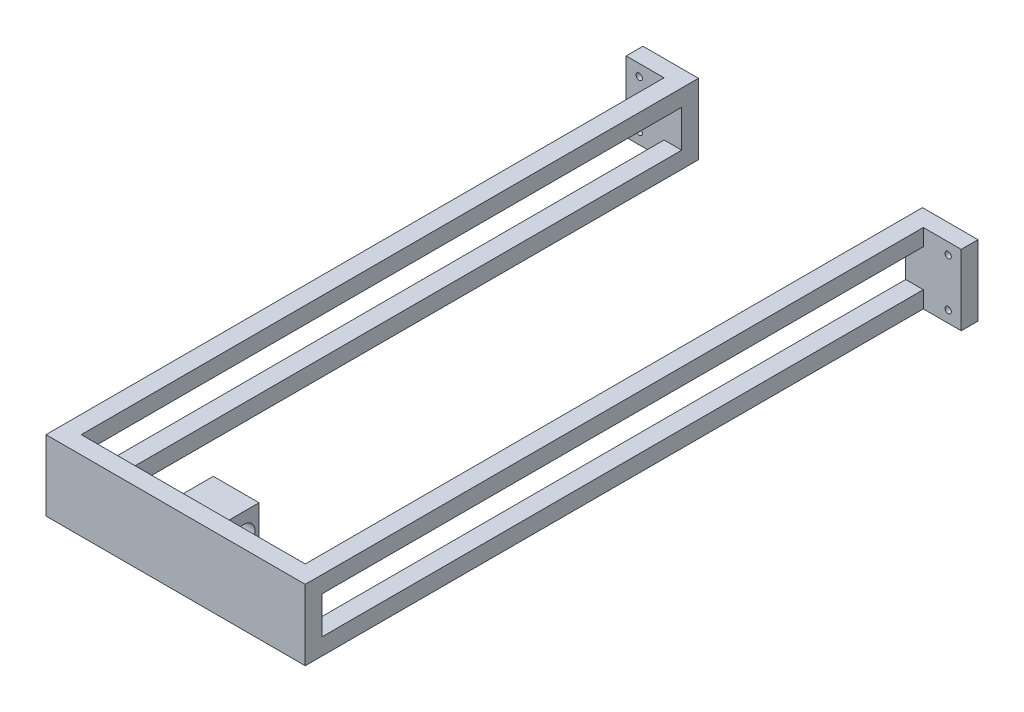
ISO-10303-21;
HEADER;
FILE_DESCRIPTION(('STEP AP214'),'2;1');
FILE_NAME('part.step','',(''),(''),'','','');
FILE_SCHEMA(('AUTOMOTIVE_DESIGN { 1 0 10303 214 1 1 1 1 }'));
ENDSEC;
DATA;
#1=APPLICATION_CONTEXT('core data for automotive mechanical design processes');
#2=APPLICATION_PROTOCOL_DEFINITION('international standard','automotive_design',2000,#1);
#3=PRODUCT_CONTEXT('',#1,'mechanical');
#4=PRODUCT('Part','Part','',(#3));
#5=PRODUCT_RELATED_PRODUCT_CATEGORY('part','',(#4));
#6=PRODUCT_DEFINITION_FORMATION('','',#4);
#7=PRODUCT_DEFINITION_CONTEXT('part definition',#1,'design');
#8=PRODUCT_DEFINITION('design','',#6,#7);
#9=PRODUCT_DEFINITION_SHAPE('','',#8);
#10=(LENGTH_UNIT() NAMED_UNIT(*) SI_UNIT(.MILLI.,.METRE.));
#11=(NAMED_UNIT(*) PLANE_ANGLE_UNIT() SI_UNIT($,.RADIAN.));
#12=(NAMED_UNIT(*) SI_UNIT($,.STERADIAN.) SOLID_ANGLE_UNIT());
#13=UNCERTAINTY_MEASURE_WITH_UNIT(LENGTH_MEASURE(1.E-05),#10,'distance_accuracy_value','');
#14=(GEOMETRIC_REPRESENTATION_CONTEXT(3) GLOBAL_UNCERTAINTY_ASSIGNED_CONTEXT((#13)) GLOBAL_UNIT_ASSIGNED_CONTEXT((#10,
#11,#12)) REPRESENTATION_CONTEXT('',''));
#15=CARTESIAN_POINT('',(0.,0.,0.));
#16=DIRECTION('',(0.,0.,1.));
#17=DIRECTION('',(1.,0.,0.));
#18=AXIS2_PLACEMENT_3D('',#15,#16,#17);
#19=CARTESIAN_POINT('',(181.925,6.7,222.6));
#20=DIRECTION('',(0.,0.,1.));
#21=DIRECTION('',(1.,0.,0.));
#22=AXIS2_PLACEMENT_3D('',#19,#20,#21);
#23=PLANE('',#22);
#24=DIRECTION('',(0.,1.,0.));
#25=VECTOR('',#24,1.);
#26=CARTESIAN_POINT('',(-8.23955739482071,8.01973597055769,222.6));
#27=LINE('',#26,#25);
#28=CARTESIAN_POINT('',(-8.23955739482071,-6.7,222.6));
#29=VERTEX_POINT('',#28);
#30=CARTESIAN_POINT('',(-8.23955739482071,6.7,222.6));
#31=VERTEX_POINT('',#30);
#32=EDGE_CURVE('E544',#29,#31,#27,.T.);
#33=ORIENTED_EDGE('',*,*,#32,.F.);
#34=DIRECTION('',(-1.,0.,0.));
#35=VECTOR('',#34,1.);
#36=CARTESIAN_POINT('',(181.925,-6.7,222.6));
#37=LINE('',#36,#35);
#38=CARTESIAN_POINT('',(-46.675,-6.69999999999998,222.6));
#39=VERTEX_POINT('',#38);
#40=EDGE_CURVE('E309',#29,#39,#37,.T.);
#41=ORIENTED_EDGE('',*,*,#40,.T.);
#42=DIRECTION('',(0.,1.,0.));
#43=VECTOR('',#42,1.);
#44=CARTESIAN_POINT('',(-46.675,6.7,222.6));
#45=LINE('',#44,#43);
#46=CARTESIAN_POINT('',(-46.675,6.7,222.6));
#47=VERTEX_POINT('',#46);
#48=EDGE_CURVE('E290',#39,#47,#45,.T.);
#49=ORIENTED_EDGE('',*,*,#48,.T.);
#50=DIRECTION('',(-1.,0.,0.));
#51=VECTOR('',#50,1.);
#52=CARTESIAN_POINT('',(181.925,6.7,222.6));
#53=LINE('',#52,#51);
#54=EDGE_CURVE('E302',#31,#47,#53,.T.);
#55=ORIENTED_EDGE('',*,*,#54,.F.);
#56=EDGE_LOOP('',(#33,#41,#49,#55));
#57=FACE_BOUND('',#56,.T.);
#58=ADVANCED_FACE('F47',(#57),#23,.F.);
#59=DIRECTION('',(0.,-1.,0.));
#60=VECTOR('',#59,1.);
#61=CARTESIAN_POINT('',(8.23955739482071,8.01973597055769,222.6));
#62=LINE('',#61,#60);
#63=CARTESIAN_POINT('',(8.23955739482071,6.7,222.6));
#64=VERTEX_POINT('',#63);
#65=CARTESIAN_POINT('',(8.23955739482071,-6.7,222.6));
#66=VERTEX_POINT('',#65);
#67=EDGE_CURVE('E255',#64,#66,#62,.T.);
#68=ORIENTED_EDGE('',*,*,#67,.F.);
#69=CARTESIAN_POINT('',(46.675,6.7,222.6));
#70=VERTEX_POINT('',#69);
#71=EDGE_CURVE('E304',#70,#64,#53,.T.);
#72=ORIENTED_EDGE('',*,*,#71,.F.);
#73=DIRECTION('',(0.,1.,0.));
#74=VECTOR('',#73,1.);
#75=CARTESIAN_POINT('',(46.675,215.9,222.6));
#76=LINE('',#75,#74);
#77=CARTESIAN_POINT('',(46.675,-6.70000000000001,222.6));
#78=VERTEX_POINT('',#77);
#79=EDGE_CURVE('E512',#78,#70,#76,.T.);
#80=ORIENTED_EDGE('',*,*,#79,.F.);
#81=EDGE_CURVE('E308',#78,#66,#37,.T.);
#82=ORIENTED_EDGE('',*,*,#81,.T.);
#83=EDGE_LOOP('',(#68,#72,#80,#82));
#84=FACE_BOUND('',#83,.T.);
#85=ADVANCED_FACE('F575',(#84),#23,.F.);
#86=CARTESIAN_POINT('',(0.,215.9,222.25));
#87=DIRECTION('',(0.,0.,-1.));
#88=DIRECTION('',(-1.,0.,0.));
#89=AXIS2_PLACEMENT_3D('',#86,#87,#88);
#90=PLANE('',#89);
#91=DIRECTION('',(-1.,0.,0.));
#92=VECTOR('',#91,1.);
#93=CARTESIAN_POINT('',(0.,8.01973597055769,222.25));
#94=LINE('',#93,#92);
#95=CARTESIAN_POINT('',(8.23955739482071,8.01973597055769,222.25));
#96=VERTEX_POINT('',#95);
#97=CARTESIAN_POINT('',(-8.23955739482071,8.01973597055769,222.25));
#98=VERTEX_POINT('',#97);
#99=EDGE_CURVE('E11',#96,#98,#94,.T.);
#100=ORIENTED_EDGE('',*,*,#99,.T.);
#101=DIRECTION('',(0.,-1.,0.));
#102=VECTOR('',#101,1.);
#103=CARTESIAN_POINT('',(-8.23955739482071,215.9,222.25));
#104=LINE('',#103,#102);
#105=CARTESIAN_POINT('',(-8.23955739482071,6.70000000000001,222.25));
#106=VERTEX_POINT('',#105);
#107=EDGE_CURVE('E256',#98,#106,#104,.T.);
#108=ORIENTED_EDGE('',*,*,#107,.T.);
#109=DIRECTION('',(1.,0.,0.));
#110=VECTOR('',#109,1.);
#111=CARTESIAN_POINT('',(0.,6.70000000000001,222.25));
#112=LINE('',#111,#110);
#113=CARTESIAN_POINT('',(-40.325,6.70000000000001,222.25));
#114=VERTEX_POINT('',#113);
#115=EDGE_CURVE('E504',#114,#106,#112,.T.);
#116=ORIENTED_EDGE('',*,*,#115,.F.);
#117=DIRECTION('',(0.,-1.,0.));
#118=VECTOR('',#117,1.);
#119=CARTESIAN_POINT('',(-40.325,215.9,222.25));
#120=LINE('',#119,#118);
#121=CARTESIAN_POINT('',(-40.325,12.7,222.25));
#122=VERTEX_POINT('',#121);
#123=EDGE_CURVE('E399',#122,#114,#120,.T.);
#124=ORIENTED_EDGE('',*,*,#123,.F.);
#125=DIRECTION('',(-1.,0.,0.));
#126=VECTOR('',#125,1.);
#127=CARTESIAN_POINT('',(-60.325,12.7,222.25));
#128=LINE('',#127,#126);
#129=CARTESIAN_POINT('',(40.325,12.7,222.25));
#130=VERTEX_POINT('',#129);
#131=EDGE_CURVE('E474',#130,#122,#128,.T.);
#132=ORIENTED_EDGE('',*,*,#131,.F.);
#133=DIRECTION('',(0.,-1.,0.));
#134=VECTOR('',#133,1.);
#135=CARTESIAN_POINT('',(40.325,215.9,222.25));
#136=LINE('',#135,#134);
#137=CARTESIAN_POINT('',(40.325,6.70000000000001,222.25));
#138=VERTEX_POINT('',#137);
#139=EDGE_CURVE('E402',#130,#138,#136,.T.);
#140=ORIENTED_EDGE('',*,*,#139,.T.);
#141=CARTESIAN_POINT('',(8.23955739482071,6.70000000000001,222.25));
#142=VERTEX_POINT('',#141);
#143=EDGE_CURVE('E501',#142,#138,#112,.T.);
#144=ORIENTED_EDGE('',*,*,#143,.F.);
#145=DIRECTION('',(0.,1.,0.));
#146=VECTOR('',#145,1.);
#147=CARTESIAN_POINT('',(8.23955739482071,215.9,222.25));
#148=LINE('',#147,#146);
#149=EDGE_CURVE('E68',#142,#96,#148,.T.);
#150=ORIENTED_EDGE('',*,*,#149,.T.);
#151=EDGE_LOOP('',(#100,#108,#116,#124,#132,#140,#144,#150));
#152=FACE_BOUND('',#151,.T.);
#153=ADVANCED_FACE('F578',(#152),#90,.T.);
#154=DIRECTION('',(-1.,0.,0.));
#155=VECTOR('',#154,1.);
#156=CARTESIAN_POINT('',(0.,-6.70000000000001,222.25));
#157=LINE('',#156,#155);
#158=CARTESIAN_POINT('',(-8.23955739482071,-6.70000000000001,222.25));
#159=VERTEX_POINT('',#158);
#160=CARTESIAN_POINT('',(-40.325,-6.70000000000001,222.25));
#161=VERTEX_POINT('',#160);
#162=EDGE_CURVE('E496',#159,#161,#157,.T.);
#163=ORIENTED_EDGE('',*,*,#162,.F.);
#164=DIRECTION('',(0.,-1.,0.));
#165=VECTOR('',#164,1.);
#166=CARTESIAN_POINT('',(-8.23955739482071,215.9,222.25));
#167=LINE('',#166,#165);
#168=CARTESIAN_POINT('',(-8.23955739482071,-8.01973597055769,222.25));
#169=VERTEX_POINT('',#168);
#170=EDGE_CURVE('E277',#159,#169,#167,.T.);
#171=ORIENTED_EDGE('',*,*,#170,.T.);
#172=DIRECTION('',(1.,0.,0.));
#173=VECTOR('',#172,1.);
#174=CARTESIAN_POINT('',(0.,-8.01973597055769,222.25));
#175=LINE('',#174,#173);
#176=CARTESIAN_POINT('',(8.23955739482071,-8.01973597055769,222.25));
#177=VERTEX_POINT('',#176);
#178=EDGE_CURVE('E56',#169,#177,#175,.T.);
#179=ORIENTED_EDGE('',*,*,#178,.T.);
#180=DIRECTION('',(0.,1.,0.));
#181=VECTOR('',#180,1.);
#182=CARTESIAN_POINT('',(8.23955739482071,215.9,222.25));
#183=LINE('',#182,#181);
#184=CARTESIAN_POINT('',(8.23955739482071,-6.7,222.25));
#185=VERTEX_POINT('',#184);
#186=EDGE_CURVE('E257',#177,#185,#183,.T.);
#187=ORIENTED_EDGE('',*,*,#186,.T.);
#188=CARTESIAN_POINT('',(40.325,-6.70000000000001,222.25));
#189=VERTEX_POINT('',#188);
#190=EDGE_CURVE('E498',#189,#185,#157,.T.);
#191=ORIENTED_EDGE('',*,*,#190,.F.);
#192=CARTESIAN_POINT('',(40.325,-12.7,222.25));
#193=VERTEX_POINT('',#192);
#194=EDGE_CURVE('E390',#189,#193,#136,.T.);
#195=ORIENTED_EDGE('',*,*,#194,.T.);
#196=DIRECTION('',(1.,0.,0.));
#197=VECTOR('',#196,1.);
#198=CARTESIAN_POINT('',(0.,-12.7,222.25));
#199=LINE('',#198,#197);
#200=CARTESIAN_POINT('',(-40.325,-12.7,222.25));
#201=VERTEX_POINT('',#200);
#202=EDGE_CURVE('E377',#201,#193,#199,.T.);
#203=ORIENTED_EDGE('',*,*,#202,.F.);
#204=EDGE_CURVE('E397',#161,#201,#120,.T.);
#205=ORIENTED_EDGE('',*,*,#204,.F.);
#206=EDGE_LOOP('',(#163,#171,#179,#187,#191,#195,#203,#205));
#207=FACE_BOUND('',#206,.T.);
#208=ADVANCED_FACE('F526',(#207),#90,.T.);
#209=CARTESIAN_POINT('',(181.925,6.7,6.03983222600579));
#210=DIRECTION('',(0.,1.,0.));
#211=DIRECTION('',(0.,0.,1.));
#212=AXIS2_PLACEMENT_3D('',#209,#210,#211);
#213=PLANE('',#212);
#214=DIRECTION('',(0.,0.,-1.));
#215=VECTOR('',#214,1.);
#216=CARTESIAN_POINT('',(-8.23955739482071,6.7,6.03983222600579));
#217=LINE('',#216,#215);
#218=EDGE_CURVE('E276',#31,#106,#217,.T.);
#219=ORIENTED_EDGE('',*,*,#218,.F.);
#220=ORIENTED_EDGE('',*,*,#54,.T.);
#221=DIRECTION('',(0.,0.,-1.));
#222=VECTOR('',#221,1.);
#223=CARTESIAN_POINT('',(-46.675,6.7,6.03983222600579));
#224=LINE('',#223,#222);
#225=CARTESIAN_POINT('',(-46.675,6.7,6.03983222600579));
#226=VERTEX_POINT('',#225);
#227=EDGE_CURVE('E295',#47,#226,#224,.T.);
#228=ORIENTED_EDGE('',*,*,#227,.T.);
#229=DIRECTION('',(-1.,0.,0.));
#230=VECTOR('',#229,1.);
#231=CARTESIAN_POINT('',(181.925,6.7,6.03983222600579));
#232=LINE('',#231,#230);
#233=CARTESIAN_POINT('',(-40.325,6.7,6.03983222600579));
#234=VERTEX_POINT('',#233);
#235=EDGE_CURVE('E300',#234,#226,#232,.T.);
#236=ORIENTED_EDGE('',*,*,#235,.F.);
#237=DIRECTION('',(0.,0.,1.));
#238=VECTOR('',#237,1.);
#239=CARTESIAN_POINT('',(-40.325,6.70000000000001,0.));
#240=LINE('',#239,#238);
#241=EDGE_CURVE('E322',#234,#114,#240,.T.);
#242=ORIENTED_EDGE('',*,*,#241,.T.);
#243=ORIENTED_EDGE('',*,*,#115,.T.);
#244=EDGE_LOOP('',(#219,#220,#228,#236,#242,#243));
#245=FACE_BOUND('',#244,.T.);
#246=ADVANCED_FACE('F581',(#245),#213,.F.);
#247=DIRECTION('',(0.,0.,1.));
#248=VECTOR('',#247,1.);
#249=CARTESIAN_POINT('',(8.23955739482071,6.7,6.03983222600579));
#250=LINE('',#249,#248);
#251=EDGE_CURVE('E264',#142,#64,#250,.T.);
#252=ORIENTED_EDGE('',*,*,#251,.F.);
#253=ORIENTED_EDGE('',*,*,#143,.T.);
#254=DIRECTION('',(0.,0.,-1.));
#255=VECTOR('',#254,1.);
#256=CARTESIAN_POINT('',(40.325,6.70000000000001,0.));
#257=LINE('',#256,#255);
#258=CARTESIAN_POINT('',(40.325,6.7,6.03983222600579));
#259=VERTEX_POINT('',#258);
#260=EDGE_CURVE('E330',#138,#259,#257,.T.);
#261=ORIENTED_EDGE('',*,*,#260,.T.);
#262=CARTESIAN_POINT('',(46.675,6.7,6.03983222600579));
#263=VERTEX_POINT('',#262);
#264=EDGE_CURVE('E297',#263,#259,#232,.T.);
#265=ORIENTED_EDGE('',*,*,#264,.F.);
#266=DIRECTION('',(0.,0.,-1.));
#267=VECTOR('',#266,1.);
#268=CARTESIAN_POINT('',(46.675,6.70000000000001,0.));
#269=LINE('',#268,#267);
#270=EDGE_CURVE('E329',#70,#263,#269,.T.);
#271=ORIENTED_EDGE('',*,*,#270,.F.);
#272=ORIENTED_EDGE('',*,*,#71,.T.);
#273=EDGE_LOOP('',(#252,#253,#261,#265,#271,#272));
#274=FACE_BOUND('',#273,.T.);
#275=ADVANCED_FACE('F589',(#274),#213,.F.);
#276=CARTESIAN_POINT('',(181.925,-6.7,6.03983222600579));
#277=DIRECTION('',(0.,-1.,0.));
#278=DIRECTION('',(0.,0.,-1.));
#279=AXIS2_PLACEMENT_3D('',#276,#277,#278);
#280=PLANE('',#279);
#281=DIRECTION('',(0.,0.,1.));
#282=VECTOR('',#281,1.);
#283=CARTESIAN_POINT('',(-8.23955739482071,-6.7,6.03983222600579));
#284=LINE('',#283,#282);
#285=EDGE_CURVE('E519',#159,#29,#284,.T.);
#286=ORIENTED_EDGE('',*,*,#285,.F.);
#287=ORIENTED_EDGE('',*,*,#162,.T.);
#288=DIRECTION('',(0.,0.,-1.));
#289=VECTOR('',#288,1.);
#290=CARTESIAN_POINT('',(-40.325,-6.70000000000001,0.));
#291=LINE('',#290,#289);
#292=CARTESIAN_POINT('',(-40.325,-6.7,6.03983222600579));
#293=VERTEX_POINT('',#292);
#294=EDGE_CURVE('E314',#161,#293,#291,.T.);
#295=ORIENTED_EDGE('',*,*,#294,.T.);
#296=DIRECTION('',(-1.,0.,0.));
#297=VECTOR('',#296,1.);
#298=CARTESIAN_POINT('',(181.925,-6.7,6.03983222600579));
#299=LINE('',#298,#297);
#300=CARTESIAN_POINT('',(-46.675,-6.7,6.03983222600579));
#301=VERTEX_POINT('',#300);
#302=EDGE_CURVE('E298',#293,#301,#299,.T.);
#303=ORIENTED_EDGE('',*,*,#302,.T.);
#304=DIRECTION('',(0.,0.,1.));
#305=VECTOR('',#304,1.);
#306=CARTESIAN_POINT('',(-46.675,-6.7,6.03983222600579));
#307=LINE('',#306,#305);
#308=EDGE_CURVE('E284',#301,#39,#307,.T.);
#309=ORIENTED_EDGE('',*,*,#308,.T.);
#310=ORIENTED_EDGE('',*,*,#40,.F.);
#311=EDGE_LOOP('',(#286,#287,#295,#303,#309,#310));
#312=FACE_BOUND('',#311,.T.);
#313=ADVANCED_FACE('F584',(#312),#280,.F.);
#314=DIRECTION('',(0.,0.,-1.));
#315=VECTOR('',#314,1.);
#316=CARTESIAN_POINT('',(8.23955739482071,-6.7,6.03983222600579));
#317=LINE('',#316,#315);
#318=EDGE_CURVE('E513',#66,#185,#317,.T.);
#319=ORIENTED_EDGE('',*,*,#318,.F.);
#320=ORIENTED_EDGE('',*,*,#81,.F.);
#321=DIRECTION('',(0.,0.,1.));
#322=VECTOR('',#321,1.);
#323=CARTESIAN_POINT('',(46.675,-6.70000000000001,0.));
#324=LINE('',#323,#322);
#325=CARTESIAN_POINT('',(46.675,-6.7,6.03983222600579));
#326=VERTEX_POINT('',#325);
#327=EDGE_CURVE('E319',#326,#78,#324,.T.);
#328=ORIENTED_EDGE('',*,*,#327,.F.);
#329=CARTESIAN_POINT('',(40.325,-6.7,6.03983222600579));
#330=VERTEX_POINT('',#329);
#331=EDGE_CURVE('E311',#326,#330,#299,.T.);
#332=ORIENTED_EDGE('',*,*,#331,.T.);
#333=DIRECTION('',(0.,0.,1.));
#334=VECTOR('',#333,1.);
#335=CARTESIAN_POINT('',(40.325,-6.70000000000001,0.));
#336=LINE('',#335,#334);
#337=EDGE_CURVE('E320',#330,#189,#336,.T.);
#338=ORIENTED_EDGE('',*,*,#337,.T.);
#339=ORIENTED_EDGE('',*,*,#190,.T.);
#340=EDGE_LOOP('',(#319,#320,#328,#332,#338,#339));
#341=FACE_BOUND('',#340,.T.);
#342=ADVANCED_FACE('F586',(#341),#280,.F.);
#343=CARTESIAN_POINT('',(-46.675,215.9,0.));
#344=DIRECTION('',(1.,0.,0.));
#345=DIRECTION('',(0.,0.,-1.));
#346=AXIS2_PLACEMENT_3D('',#343,#344,#345);
#347=PLANE('',#346);
#348=ORIENTED_EDGE('',*,*,#308,.F.);
#349=DIRECTION('',(0.,-1.,0.));
#350=VECTOR('',#349,1.);
#351=CARTESIAN_POINT('',(-46.675,215.9,6.03983222600579));
#352=LINE('',#351,#350);
#353=CARTESIAN_POINT('',(-46.675,-12.7,6.03983222600579));
#354=VERTEX_POINT('',#353);
#355=EDGE_CURVE('E347',#301,#354,#352,.T.);
#356=ORIENTED_EDGE('',*,*,#355,.T.);
#357=DIRECTION('',(0.,0.,1.));
#358=VECTOR('',#357,1.);
#359=CARTESIAN_POINT('',(-46.675,-12.7,0.));
#360=LINE('',#359,#358);
#361=CARTESIAN_POINT('',(-46.675,-12.7,228.6));
#362=VERTEX_POINT('',#361);
#363=EDGE_CURVE('E341',#354,#362,#360,.T.);
#364=ORIENTED_EDGE('',*,*,#363,.T.);
#365=DIRECTION('',(0.,-1.,0.));
#366=VECTOR('',#365,1.);
#367=CARTESIAN_POINT('',(-46.675,215.9,228.6));
#368=LINE('',#367,#366);
#369=CARTESIAN_POINT('',(-46.675,12.7,228.6));
#370=VERTEX_POINT('',#369);
#371=EDGE_CURVE('E353',#370,#362,#368,.T.);
#372=ORIENTED_EDGE('',*,*,#371,.F.);
#373=DIRECTION('',(0.,0.,-1.));
#374=VECTOR('',#373,1.);
#375=CARTESIAN_POINT('',(-46.675,12.7,228.6));
#376=LINE('',#375,#374);
#377=CARTESIAN_POINT('',(-46.675,12.7,6.03983222600579));
#378=VERTEX_POINT('',#377);
#379=EDGE_CURVE('E492',#370,#378,#376,.T.);
#380=ORIENTED_EDGE('',*,*,#379,.T.);
#381=EDGE_CURVE('E352',#378,#226,#352,.T.);
#382=ORIENTED_EDGE('',*,*,#381,.T.);
#383=ORIENTED_EDGE('',*,*,#227,.F.);
#384=ORIENTED_EDGE('',*,*,#48,.F.);
#385=EDGE_LOOP('',(#348,#356,#364,#372,#380,#382,#383,#384));
#386=FACE_BOUND('',#385,.T.);
#387=ADVANCED_FACE('F591',(#386),#347,.F.);
#388=CARTESIAN_POINT('',(-60.325,12.7,228.6));
#389=DIRECTION('',(1.,0.,0.));
#390=DIRECTION('',(0.,0.,-1.));
#391=AXIS2_PLACEMENT_3D('',#388,#389,#390);
#392=PLANE('',#391);
#393=DIRECTION('',(0.,-1.,0.));
#394=VECTOR('',#393,1.);
#395=CARTESIAN_POINT('',(-60.325,215.9,6.03983222600579));
#396=LINE('',#395,#394);
#397=CARTESIAN_POINT('',(-60.325,12.7,6.03983222600579));
#398=VERTEX_POINT('',#397);
#399=CARTESIAN_POINT('',(-60.325,-12.7,6.03983222600579));
#400=VERTEX_POINT('',#399);
#401=EDGE_CURVE('E350',#398,#400,#396,.T.);
#402=ORIENTED_EDGE('',*,*,#401,.F.);
#403=DIRECTION('',(0.,0.,-1.));
#404=VECTOR('',#403,1.);
#405=CARTESIAN_POINT('',(-60.325,12.7,228.6));
#406=LINE('',#405,#404);
#407=CARTESIAN_POINT('',(-60.325,12.7,0.));
#408=VERTEX_POINT('',#407);
#409=EDGE_CURVE('E450',#398,#408,#406,.T.);
#410=ORIENTED_EDGE('',*,*,#409,.T.);
#411=DIRECTION('',(0.,-1.,0.));
#412=VECTOR('',#411,1.);
#413=CARTESIAN_POINT('',(-60.325,12.7,0.));
#414=LINE('',#413,#412);
#415=CARTESIAN_POINT('',(-60.325,-12.7,0.));
#416=VERTEX_POINT('',#415);
#417=EDGE_CURVE('E440',#408,#416,#414,.T.);
#418=ORIENTED_EDGE('',*,*,#417,.T.);
#419=DIRECTION('',(0.,0.,-1.));
#420=VECTOR('',#419,1.);
#421=CARTESIAN_POINT('',(-60.325,-12.7,228.6));
#422=LINE('',#421,#420);
#423=EDGE_CURVE('E472',#400,#416,#422,.T.);
#424=ORIENTED_EDGE('',*,*,#423,.F.);
#425=EDGE_LOOP('',(#402,#410,#418,#424));
#426=FACE_BOUND('',#425,.T.);
#427=ADVANCED_FACE('F51',(#426),#392,.F.);
#428=CARTESIAN_POINT('',(60.325,12.7,228.6));
#429=DIRECTION('',(1.,0.,0.));
#430=DIRECTION('',(0.,0.,-1.));
#431=AXIS2_PLACEMENT_3D('',#428,#429,#430);
#432=PLANE('',#431);
#433=DIRECTION('',(0.,0.,-1.));
#434=VECTOR('',#433,1.);
#435=CARTESIAN_POINT('',(60.325,12.7,228.6));
#436=LINE('',#435,#434);
#437=CARTESIAN_POINT('',(60.325,12.7,6.03983222600579));
#438=VERTEX_POINT('',#437);
#439=CARTESIAN_POINT('',(60.325,12.7,0.));
#440=VERTEX_POINT('',#439);
#441=EDGE_CURVE('E469',#438,#440,#436,.T.);
#442=ORIENTED_EDGE('',*,*,#441,.F.);
#443=DIRECTION('',(0.,-1.,0.));
#444=VECTOR('',#443,1.);
#445=CARTESIAN_POINT('',(60.325,215.9,6.03983222600579));
#446=LINE('',#445,#444);
#447=CARTESIAN_POINT('',(60.325,-12.7,6.03983222600579));
#448=VERTEX_POINT('',#447);
#449=EDGE_CURVE('E369',#438,#448,#446,.T.);
#450=ORIENTED_EDGE('',*,*,#449,.T.);
#451=DIRECTION('',(0.,0.,-1.));
#452=VECTOR('',#451,1.);
#453=CARTESIAN_POINT('',(60.325,-12.7,228.6));
#454=LINE('',#453,#452);
#455=CARTESIAN_POINT('',(60.325,-12.7,0.));
#456=VERTEX_POINT('',#455);
#457=EDGE_CURVE('E468',#448,#456,#454,.T.);
#458=ORIENTED_EDGE('',*,*,#457,.T.);
#459=DIRECTION('',(0.,-1.,0.));
#460=VECTOR('',#459,1.);
#461=CARTESIAN_POINT('',(60.325,12.7,0.));
#462=LINE('',#461,#460);
#463=EDGE_CURVE('E457',#440,#456,#462,.T.);
#464=ORIENTED_EDGE('',*,*,#463,.F.);
#465=EDGE_LOOP('',(#442,#450,#458,#464));
#466=FACE_BOUND('',#465,.T.);
#467=ADVANCED_FACE('F636',(#466),#432,.T.);
#468=CARTESIAN_POINT('',(0.,0.,228.6));
#469=DIRECTION('',(0.,0.,1.));
#470=DIRECTION('',(1.,0.,0.));
#471=AXIS2_PLACEMENT_3D('',#468,#469,#470);
#472=PLANE('',#471);
#473=DIRECTION('',(0.,-1.,0.));
#474=VECTOR('',#473,1.);
#475=CARTESIAN_POINT('',(46.675,215.9,228.6));
#476=LINE('',#475,#474);
#477=CARTESIAN_POINT('',(46.675,12.7,228.6));
#478=VERTEX_POINT('',#477);
#479=CARTESIAN_POINT('',(46.675,-12.7,228.6));
#480=VERTEX_POINT('',#479);
#481=EDGE_CURVE('E345',#478,#480,#476,.T.);
#482=ORIENTED_EDGE('',*,*,#481,.F.);
#483=DIRECTION('',(1.,0.,0.));
#484=VECTOR('',#483,1.);
#485=CARTESIAN_POINT('',(-60.325,12.7,228.6));
#486=LINE('',#485,#484);
#487=EDGE_CURVE('E445',#370,#478,#486,.T.);
#488=ORIENTED_EDGE('',*,*,#487,.F.);
#489=ORIENTED_EDGE('',*,*,#371,.T.);
#490=DIRECTION('',(1.,0.,0.));
#491=VECTOR('',#490,1.);
#492=CARTESIAN_POINT('',(-60.325,-12.7,228.6));
#493=LINE('',#492,#491);
#494=EDGE_CURVE('E437',#362,#480,#493,.T.);
#495=ORIENTED_EDGE('',*,*,#494,.T.);
#496=EDGE_LOOP('',(#482,#488,#489,#495));
#497=FACE_BOUND('',#496,.T.);
#498=ADVANCED_FACE('F633',(#497),#472,.T.);
#499=CARTESIAN_POINT('',(0.,0.,0.));
#500=DIRECTION('',(0.,0.,1.));
#501=DIRECTION('',(1.,0.,0.));
#502=AXIS2_PLACEMENT_3D('',#499,#500,#501);
#503=PLANE('',#502);
#504=CARTESIAN_POINT('',(55.626,-8.5698965,0.));
#505=DIRECTION('',(0.,0.,1.));
#506=DIRECTION('',(1.,0.,0.));
#507=AXIS2_PLACEMENT_3D('',#504,#505,#506);
#508=CIRCLE('',#507,1.13029999999996);
#509=CARTESIAN_POINT('',(56.7563,-8.5698965,0.));
#510=VERTEX_POINT('',#509);
#511=EDGE_CURVE('E433',#510,#510,#508,.T.);
#512=ORIENTED_EDGE('',*,*,#511,.T.);
#513=EDGE_LOOP('',(#512));
#514=FACE_BOUND('',#513,.T.);
#515=CARTESIAN_POINT('',(55.626,8.5698965,0.));
#516=DIRECTION('',(0.,0.,1.));
#517=DIRECTION('',(1.,0.,0.));
#518=AXIS2_PLACEMENT_3D('',#515,#516,#517);
#519=CIRCLE('',#518,1.13029999999996);
#520=CARTESIAN_POINT('',(56.7563,8.5698965,0.));
#521=VERTEX_POINT('',#520);
#522=EDGE_CURVE('E427',#521,#521,#519,.T.);
#523=ORIENTED_EDGE('',*,*,#522,.T.);
#524=EDGE_LOOP('',(#523));
#525=FACE_BOUND('',#524,.T.);
#526=DIRECTION('',(0.,-1.,0.));
#527=VECTOR('',#526,1.);
#528=CARTESIAN_POINT('',(40.325,215.9,0.));
#529=LINE('',#528,#527);
#530=CARTESIAN_POINT('',(40.325,12.7,0.));
#531=VERTEX_POINT('',#530);
#532=CARTESIAN_POINT('',(40.325,-12.7,0.));
#533=VERTEX_POINT('',#532);
#534=EDGE_CURVE('E389',#531,#533,#529,.T.);
#535=ORIENTED_EDGE('',*,*,#534,.F.);
#536=DIRECTION('',(1.,0.,0.));
#537=VECTOR('',#536,1.);
#538=CARTESIAN_POINT('',(-60.325,12.7,0.));
#539=LINE('',#538,#537);
#540=EDGE_CURVE('E458',#531,#440,#539,.T.);
#541=ORIENTED_EDGE('',*,*,#540,.T.);
#542=ORIENTED_EDGE('',*,*,#463,.T.);
#543=DIRECTION('',(1.,0.,0.));
#544=VECTOR('',#543,1.);
#545=CARTESIAN_POINT('',(-60.325,-12.7,0.));
#546=LINE('',#545,#544);
#547=EDGE_CURVE('E454',#533,#456,#546,.T.);
#548=ORIENTED_EDGE('',*,*,#547,.F.);
#549=EDGE_LOOP('',(#535,#541,#542,#548));
#550=FACE_BOUND('',#549,.T.);
#551=ADVANCED_FACE('F637',(#514,#525,#550),#503,.F.);
#552=CARTESIAN_POINT('',(-60.325,-12.7,228.6));
#553=DIRECTION('',(0.,1.,0.));
#554=DIRECTION('',(0.,0.,1.));
#555=AXIS2_PLACEMENT_3D('',#552,#553,#554);
#556=PLANE('',#555);
#557=DIRECTION('',(0.,0.,-1.));
#558=VECTOR('',#557,1.);
#559=CARTESIAN_POINT('',(46.675,-12.7,0.));
#560=LINE('',#559,#558);
#561=CARTESIAN_POINT('',(46.675,-12.7,6.03983222600579));
#562=VERTEX_POINT('',#561);
#563=EDGE_CURVE('E340',#480,#562,#560,.T.);
#564=ORIENTED_EDGE('',*,*,#563,.F.);
#565=ORIENTED_EDGE('',*,*,#494,.F.);
#566=ORIENTED_EDGE('',*,*,#363,.F.);
#567=DIRECTION('',(-1.,0.,0.));
#568=VECTOR('',#567,1.);
#569=CARTESIAN_POINT('',(0.,-12.7,6.03983222600579));
#570=LINE('',#569,#568);
#571=EDGE_CURVE('E336',#354,#400,#570,.T.);
#572=ORIENTED_EDGE('',*,*,#571,.T.);
#573=ORIENTED_EDGE('',*,*,#423,.T.);
#574=CARTESIAN_POINT('',(-40.325,-12.7,0.));
#575=VERTEX_POINT('',#574);
#576=EDGE_CURVE('E451',#416,#575,#546,.T.);
#577=ORIENTED_EDGE('',*,*,#576,.T.);
#578=DIRECTION('',(0.,0.,1.));
#579=VECTOR('',#578,1.);
#580=CARTESIAN_POINT('',(-40.325,-12.7,0.));
#581=LINE('',#580,#579);
#582=EDGE_CURVE('E382',#575,#201,#581,.T.);
#583=ORIENTED_EDGE('',*,*,#582,.T.);
#584=ORIENTED_EDGE('',*,*,#202,.T.);
#585=DIRECTION('',(0.,0.,-1.));
#586=VECTOR('',#585,1.);
#587=CARTESIAN_POINT('',(40.325,-12.7,0.));
#588=LINE('',#587,#586);
#589=EDGE_CURVE('E348',#193,#533,#588,.T.);
#590=ORIENTED_EDGE('',*,*,#589,.T.);
#591=ORIENTED_EDGE('',*,*,#547,.T.);
#592=ORIENTED_EDGE('',*,*,#457,.F.);
#593=DIRECTION('',(1.,0.,0.));
#594=VECTOR('',#593,1.);
#595=CARTESIAN_POINT('',(0.,-12.7,6.03983222600579));
#596=LINE('',#595,#594);
#597=EDGE_CURVE('E362',#562,#448,#596,.T.);
#598=ORIENTED_EDGE('',*,*,#597,.F.);
#599=EDGE_LOOP('',(#564,#565,#566,#572,#573,#577,#583,#584,#590,#591,#592,#598));
#600=FACE_BOUND('',#599,.T.);
#601=ADVANCED_FACE('F642',(#600),#556,.F.);
#602=CARTESIAN_POINT('',(-60.325,12.7,228.6));
#603=DIRECTION('',(0.,1.,0.));
#604=DIRECTION('',(0.,0.,1.));
#605=AXIS2_PLACEMENT_3D('',#602,#603,#604);
#606=PLANE('',#605);
#607=DIRECTION('',(0.,0.,1.));
#608=VECTOR('',#607,1.);
#609=CARTESIAN_POINT('',(46.675,12.7,228.6));
#610=LINE('',#609,#608);
#611=CARTESIAN_POINT('',(46.675,12.7,6.03983222600579));
#612=VERTEX_POINT('',#611);
#613=EDGE_CURVE('E497',#612,#478,#610,.T.);
#614=ORIENTED_EDGE('',*,*,#613,.F.);
#615=DIRECTION('',(-1.,0.,0.));
#616=VECTOR('',#615,1.);
#617=CARTESIAN_POINT('',(-60.325,12.7,6.03983222600579));
#618=LINE('',#617,#616);
#619=EDGE_CURVE('E416',#438,#612,#618,.T.);
#620=ORIENTED_EDGE('',*,*,#619,.F.);
#621=ORIENTED_EDGE('',*,*,#441,.T.);
#622=ORIENTED_EDGE('',*,*,#540,.F.);
#623=DIRECTION('',(0.,0.,1.));
#624=VECTOR('',#623,1.);
#625=CARTESIAN_POINT('',(40.325,12.7,228.6));
#626=LINE('',#625,#624);
#627=EDGE_CURVE('E487',#531,#130,#626,.T.);
#628=ORIENTED_EDGE('',*,*,#627,.T.);
#629=ORIENTED_EDGE('',*,*,#131,.T.);
#630=DIRECTION('',(0.,0.,-1.));
#631=VECTOR('',#630,1.);
#632=CARTESIAN_POINT('',(-40.325,12.7,228.6));
#633=LINE('',#632,#631);
#634=CARTESIAN_POINT('',(-40.325,12.7,0.));
#635=VERTEX_POINT('',#634);
#636=EDGE_CURVE('E484',#122,#635,#633,.T.);
#637=ORIENTED_EDGE('',*,*,#636,.T.);
#638=EDGE_CURVE('E444',#408,#635,#539,.T.);
#639=ORIENTED_EDGE('',*,*,#638,.F.);
#640=ORIENTED_EDGE('',*,*,#409,.F.);
#641=DIRECTION('',(1.,0.,0.));
#642=VECTOR('',#641,1.);
#643=CARTESIAN_POINT('',(-60.325,12.7,6.03983222600579));
#644=LINE('',#643,#642);
#645=EDGE_CURVE('E409',#398,#378,#644,.T.);
#646=ORIENTED_EDGE('',*,*,#645,.T.);
#647=ORIENTED_EDGE('',*,*,#379,.F.);
#648=ORIENTED_EDGE('',*,*,#487,.T.);
#649=EDGE_LOOP('',(#614,#620,#621,#622,#628,#629,#637,#639,#640,#646,#647,#648));
#650=FACE_BOUND('',#649,.T.);
#651=ADVANCED_FACE('F623',(#650),#606,.T.);
#652=CARTESIAN_POINT('',(-55.626,-8.5698965,228.6));
#653=DIRECTION('',(0.,0.,1.));
#654=DIRECTION('',(1.,0.,0.));
#655=AXIS2_PLACEMENT_3D('',#652,#653,#654);
#656=CYLINDRICAL_SURFACE('',#655,1.13029999999997);
#657=CARTESIAN_POINT('',(-55.626,-8.5698965,0.));
#658=DIRECTION('',(0.,0.,1.));
#659=DIRECTION('',(1.,0.,0.));
#660=AXIS2_PLACEMENT_3D('',#657,#658,#659);
#661=CIRCLE('',#660,1.13029999999996);
#662=CARTESIAN_POINT('',(-54.4957,-8.5698965,0.));
#663=VERTEX_POINT('',#662);
#664=EDGE_CURVE('E422',#663,#663,#661,.T.);
#665=ORIENTED_EDGE('',*,*,#664,.F.);
#666=EDGE_LOOP('',(#665));
#667=FACE_BOUND('',#666,.T.);
#668=CARTESIAN_POINT('',(-55.626,-8.5698965,6.03983222600579));
#669=DIRECTION('',(0.,0.,1.));
#670=DIRECTION('',(1.,0.,0.));
#671=AXIS2_PLACEMENT_3D('',#668,#669,#670);
#672=CIRCLE('',#671,1.13029999999997);
#673=CARTESIAN_POINT('',(-54.4957,-8.5698965,6.03983222600579));
#674=VERTEX_POINT('',#673);
#675=EDGE_CURVE('E403',#674,#674,#672,.F.);
#676=ORIENTED_EDGE('',*,*,#675,.F.);
#677=EDGE_LOOP('',(#676));
#678=FACE_BOUND('',#677,.T.);
#679=ADVANCED_FACE('F622',(#667,#678),#656,.F.);
#680=CARTESIAN_POINT('',(-55.626,8.5698965,228.6));
#681=DIRECTION('',(0.,0.,1.));
#682=DIRECTION('',(1.,0.,0.));
#683=AXIS2_PLACEMENT_3D('',#680,#681,#682);
#684=CYLINDRICAL_SURFACE('',#683,1.13029999999997);
#685=CARTESIAN_POINT('',(-55.626,8.5698965,0.));
#686=DIRECTION('',(0.,0.,1.));
#687=DIRECTION('',(1.,0.,0.));
#688=AXIS2_PLACEMENT_3D('',#685,#686,#687);
#689=CIRCLE('',#688,1.13029999999996);
#690=CARTESIAN_POINT('',(-54.4957,8.5698965,0.));
#691=VERTEX_POINT('',#690);
#692=EDGE_CURVE('E423',#691,#691,#689,.T.);
#693=ORIENTED_EDGE('',*,*,#692,.F.);
#694=EDGE_LOOP('',(#693));
#695=FACE_BOUND('',#694,.T.);
#696=CARTESIAN_POINT('',(-55.626,8.5698965,6.03983222600579));
#697=DIRECTION('',(0.,0.,1.));
#698=DIRECTION('',(1.,0.,0.));
#699=AXIS2_PLACEMENT_3D('',#696,#697,#698);
#700=CIRCLE('',#699,1.13029999999997);
#701=CARTESIAN_POINT('',(-54.4957,8.5698965,6.03983222600579));
#702=VERTEX_POINT('',#701);
#703=EDGE_CURVE('E393',#702,#702,#700,.F.);
#704=ORIENTED_EDGE('',*,*,#703,.F.);
#705=EDGE_LOOP('',(#704));
#706=FACE_BOUND('',#705,.T.);
#707=ADVANCED_FACE('F616',(#695,#706),#684,.F.);
#708=ORIENTED_EDGE('',*,*,#692,.T.);
#709=EDGE_LOOP('',(#708));
#710=FACE_BOUND('',#709,.T.);
#711=ORIENTED_EDGE('',*,*,#664,.T.);
#712=EDGE_LOOP('',(#711));
#713=FACE_BOUND('',#712,.T.);
#714=ORIENTED_EDGE('',*,*,#638,.T.);
#715=DIRECTION('',(0.,-1.,0.));
#716=VECTOR('',#715,1.);
#717=CARTESIAN_POINT('',(-40.325,215.9,0.));
#718=LINE('',#717,#716);
#719=EDGE_CURVE('E395',#635,#575,#718,.T.);
#720=ORIENTED_EDGE('',*,*,#719,.T.);
#721=ORIENTED_EDGE('',*,*,#576,.F.);
#722=ORIENTED_EDGE('',*,*,#417,.F.);
#723=EDGE_LOOP('',(#714,#720,#721,#722));
#724=FACE_BOUND('',#723,.T.);
#725=ADVANCED_FACE('F617',(#710,#713,#724),#503,.F.);
#726=CARTESIAN_POINT('',(55.626,-8.5698965,228.6));
#727=DIRECTION('',(0.,0.,1.));
#728=DIRECTION('',(1.,0.,0.));
#729=AXIS2_PLACEMENT_3D('',#726,#727,#728);
#730=CYLINDRICAL_SURFACE('',#729,1.13029999999997);
#731=CARTESIAN_POINT('',(55.626,-8.5698965,6.03983222600579));
#732=DIRECTION('',(0.,0.,-1.));
#733=DIRECTION('',(-1.,0.,0.));
#734=AXIS2_PLACEMENT_3D('',#731,#732,#733);
#735=CIRCLE('',#734,1.13029999999997);
#736=CARTESIAN_POINT('',(54.4957,-8.5698965,6.03983222600579));
#737=VERTEX_POINT('',#736);
#738=EDGE_CURVE('E413',#737,#737,#735,.F.);
#739=ORIENTED_EDGE('',*,*,#738,.T.);
#740=EDGE_LOOP('',(#739));
#741=FACE_BOUND('',#740,.T.);
#742=ORIENTED_EDGE('',*,*,#511,.F.);
#743=EDGE_LOOP('',(#742));
#744=FACE_BOUND('',#743,.T.);
#745=ADVANCED_FACE('F629',(#741,#744),#730,.F.);
#746=CARTESIAN_POINT('',(55.626,8.5698965,228.6));
#747=DIRECTION('',(0.,0.,1.));
#748=DIRECTION('',(1.,0.,0.));
#749=AXIS2_PLACEMENT_3D('',#746,#747,#748);
#750=CYLINDRICAL_SURFACE('',#749,1.13029999999997);
#751=CARTESIAN_POINT('',(55.626,8.5698965,6.03983222600579));
#752=DIRECTION('',(0.,0.,-1.));
#753=DIRECTION('',(-1.,0.,0.));
#754=AXIS2_PLACEMENT_3D('',#751,#752,#753);
#755=CIRCLE('',#754,1.13029999999997);
#756=CARTESIAN_POINT('',(54.4957,8.5698965,6.03983222600579));
#757=VERTEX_POINT('',#756);
#758=EDGE_CURVE('E415',#757,#757,#755,.F.);
#759=ORIENTED_EDGE('',*,*,#758,.T.);
#760=EDGE_LOOP('',(#759));
#761=FACE_BOUND('',#760,.T.);
#762=ORIENTED_EDGE('',*,*,#522,.F.);
#763=EDGE_LOOP('',(#762));
#764=FACE_BOUND('',#763,.T.);
#765=ADVANCED_FACE('F597',(#761,#764),#750,.F.);
#766=CARTESIAN_POINT('',(0.,215.9,6.03983222600579));
#767=DIRECTION('',(0.,0.,1.));
#768=DIRECTION('',(1.,0.,0.));
#769=AXIS2_PLACEMENT_3D('',#766,#767,#768);
#770=PLANE('',#769);
#771=ORIENTED_EDGE('',*,*,#401,.T.);
#772=ORIENTED_EDGE('',*,*,#571,.F.);
#773=ORIENTED_EDGE('',*,*,#355,.F.);
#774=ORIENTED_EDGE('',*,*,#302,.F.);
#775=DIRECTION('',(0.,1.,0.));
#776=VECTOR('',#775,1.);
#777=CARTESIAN_POINT('',(-40.325,215.9,6.03983222600577));
#778=LINE('',#777,#776);
#779=EDGE_CURVE('E510',#293,#234,#778,.T.);
#780=ORIENTED_EDGE('',*,*,#779,.T.);
#781=ORIENTED_EDGE('',*,*,#235,.T.);
#782=ORIENTED_EDGE('',*,*,#381,.F.);
#783=ORIENTED_EDGE('',*,*,#645,.F.);
#784=EDGE_LOOP('',(#771,#772,#773,#774,#780,#781,#782,#783));
#785=FACE_BOUND('',#784,.T.);
#786=ORIENTED_EDGE('',*,*,#703,.T.);
#787=EDGE_LOOP('',(#786));
#788=FACE_BOUND('',#787,.T.);
#789=ORIENTED_EDGE('',*,*,#675,.T.);
#790=EDGE_LOOP('',(#789));
#791=FACE_BOUND('',#790,.T.);
#792=ADVANCED_FACE('F594',(#785,#788,#791),#770,.T.);
#793=CARTESIAN_POINT('',(0.,215.9,6.03983222600579));
#794=DIRECTION('',(0.,0.,-1.));
#795=DIRECTION('',(-1.,0.,0.));
#796=AXIS2_PLACEMENT_3D('',#793,#794,#795);
#797=PLANE('',#796);
#798=ORIENTED_EDGE('',*,*,#597,.T.);
#799=ORIENTED_EDGE('',*,*,#449,.F.);
#800=ORIENTED_EDGE('',*,*,#619,.T.);
#801=DIRECTION('',(0.,-1.,0.));
#802=VECTOR('',#801,1.);
#803=CARTESIAN_POINT('',(46.675,215.9,6.03983222600579));
#804=LINE('',#803,#802);
#805=EDGE_CURVE('E375',#612,#263,#804,.T.);
#806=ORIENTED_EDGE('',*,*,#805,.T.);
#807=ORIENTED_EDGE('',*,*,#264,.T.);
#808=DIRECTION('',(0.,-1.,0.));
#809=VECTOR('',#808,1.);
#810=CARTESIAN_POINT('',(40.325,215.9,6.03983222600577));
#811=LINE('',#810,#809);
#812=EDGE_CURVE('E331',#259,#330,#811,.T.);
#813=ORIENTED_EDGE('',*,*,#812,.T.);
#814=ORIENTED_EDGE('',*,*,#331,.F.);
#815=EDGE_CURVE('E368',#326,#562,#804,.T.);
#816=ORIENTED_EDGE('',*,*,#815,.T.);
#817=EDGE_LOOP('',(#798,#799,#800,#806,#807,#813,#814,#816));
#818=FACE_BOUND('',#817,.T.);
#819=ORIENTED_EDGE('',*,*,#738,.F.);
#820=EDGE_LOOP('',(#819));
#821=FACE_BOUND('',#820,.T.);
#822=ORIENTED_EDGE('',*,*,#758,.F.);
#823=EDGE_LOOP('',(#822));
#824=FACE_BOUND('',#823,.T.);
#825=ADVANCED_FACE('F598',(#818,#821,#824),#797,.F.);
#826=CARTESIAN_POINT('',(46.675,215.9,0.));
#827=DIRECTION('',(-1.,0.,0.));
#828=DIRECTION('',(0.,0.,1.));
#829=AXIS2_PLACEMENT_3D('',#826,#827,#828);
#830=PLANE('',#829);
#831=ORIENTED_EDGE('',*,*,#79,.T.);
#832=ORIENTED_EDGE('',*,*,#270,.T.);
#833=ORIENTED_EDGE('',*,*,#805,.F.);
#834=ORIENTED_EDGE('',*,*,#613,.T.);
#835=ORIENTED_EDGE('',*,*,#481,.T.);
#836=ORIENTED_EDGE('',*,*,#563,.T.);
#837=ORIENTED_EDGE('',*,*,#815,.F.);
#838=ORIENTED_EDGE('',*,*,#327,.T.);
#839=EDGE_LOOP('',(#831,#832,#833,#834,#835,#836,#837,#838));
#840=FACE_BOUND('',#839,.T.);
#841=ADVANCED_FACE('F602',(#840),#830,.F.);
#842=CARTESIAN_POINT('',(40.325,215.9,0.));
#843=DIRECTION('',(-1.,0.,0.));
#844=DIRECTION('',(0.,0.,1.));
#845=AXIS2_PLACEMENT_3D('',#842,#843,#844);
#846=PLANE('',#845);
#847=ORIENTED_EDGE('',*,*,#260,.F.);
#848=ORIENTED_EDGE('',*,*,#139,.F.);
#849=ORIENTED_EDGE('',*,*,#627,.F.);
#850=ORIENTED_EDGE('',*,*,#534,.T.);
#851=ORIENTED_EDGE('',*,*,#589,.F.);
#852=ORIENTED_EDGE('',*,*,#194,.F.);
#853=ORIENTED_EDGE('',*,*,#337,.F.);
#854=ORIENTED_EDGE('',*,*,#812,.F.);
#855=EDGE_LOOP('',(#847,#848,#849,#850,#851,#852,#853,#854));
#856=FACE_BOUND('',#855,.T.);
#857=ADVANCED_FACE('F610',(#856),#846,.T.);
#858=CARTESIAN_POINT('',(-40.325,215.9,0.));
#859=DIRECTION('',(1.,0.,0.));
#860=DIRECTION('',(0.,0.,-1.));
#861=AXIS2_PLACEMENT_3D('',#858,#859,#860);
#862=PLANE('',#861);
#863=ORIENTED_EDGE('',*,*,#241,.F.);
#864=ORIENTED_EDGE('',*,*,#779,.F.);
#865=ORIENTED_EDGE('',*,*,#294,.F.);
#866=ORIENTED_EDGE('',*,*,#204,.T.);
#867=ORIENTED_EDGE('',*,*,#582,.F.);
#868=ORIENTED_EDGE('',*,*,#719,.F.);
#869=ORIENTED_EDGE('',*,*,#636,.F.);
#870=ORIENTED_EDGE('',*,*,#123,.T.);
#871=EDGE_LOOP('',(#863,#864,#865,#866,#867,#868,#869,#870));
#872=FACE_BOUND('',#871,.T.);
#873=ADVANCED_FACE('F606',(#872),#862,.T.);
#874=CARTESIAN_POINT('',(-8.23955739482071,8.01973597055769,206.79));
#875=DIRECTION('',(1.,0.,0.));
#876=DIRECTION('',(0.,0.,-1.));
#877=AXIS2_PLACEMENT_3D('',#874,#875,#876);
#878=PLANE('',#877);
#879=CARTESIAN_POINT('',(-8.23955739482071,0.,212.327683200179));
#880=DIRECTION('',(-1.,0.,0.));
#881=DIRECTION('',(0.,0.,1.));
#882=AXIS2_PLACEMENT_3D('',#879,#880,#881);
#883=CIRCLE('',#882,4.06400000000002);
#884=CARTESIAN_POINT('',(-8.23955739482071,0.,216.391683200179));
#885=VERTEX_POINT('',#884);
#886=EDGE_CURVE('E554',#885,#885,#883,.T.);
#887=ORIENTED_EDGE('',*,*,#886,.F.);
#888=EDGE_LOOP('',(#887));
#889=FACE_BOUND('',#888,.T.);
#890=ORIENTED_EDGE('',*,*,#107,.F.);
#891=DIRECTION('',(0.,0.,1.));
#892=VECTOR('',#891,1.);
#893=CARTESIAN_POINT('',(-8.23955739482071,8.01973597055769,206.79));
#894=LINE('',#893,#892);
#895=CARTESIAN_POINT('',(-8.23955739482071,8.01973597055769,206.79));
#896=VERTEX_POINT('',#895);
#897=EDGE_CURVE('E240',#896,#98,#894,.T.);
#898=ORIENTED_EDGE('',*,*,#897,.F.);
#899=DIRECTION('',(0.,1.,0.));
#900=VECTOR('',#899,1.);
#901=CARTESIAN_POINT('',(-8.23955739482071,8.01973597055769,206.79));
#902=LINE('',#901,#900);
#903=CARTESIAN_POINT('',(-8.23955739482071,-8.01973597055769,206.79));
#904=VERTEX_POINT('',#903);
#905=EDGE_CURVE('E244',#904,#896,#902,.T.);
#906=ORIENTED_EDGE('',*,*,#905,.F.);
#907=DIRECTION('',(0.,0.,1.));
#908=VECTOR('',#907,1.);
#909=CARTESIAN_POINT('',(-8.23955739482071,-8.01973597055769,206.79));
#910=LINE('',#909,#908);
#911=EDGE_CURVE('E537',#904,#169,#910,.T.);
#912=ORIENTED_EDGE('',*,*,#911,.T.);
#913=ORIENTED_EDGE('',*,*,#170,.F.);
#914=ORIENTED_EDGE('',*,*,#285,.T.);
#915=ORIENTED_EDGE('',*,*,#32,.T.);
#916=ORIENTED_EDGE('',*,*,#218,.T.);
#917=EDGE_LOOP('',(#890,#898,#906,#912,#913,#914,#915,#916));
#918=FACE_BOUND('',#917,.T.);
#919=ADVANCED_FACE('F258',(#889,#918),#878,.F.);
#920=CARTESIAN_POINT('',(8.23955739482071,8.01973597055769,206.79));
#921=DIRECTION('',(0.,-1.,0.));
#922=DIRECTION('',(0.,0.,-1.));
#923=AXIS2_PLACEMENT_3D('',#920,#921,#922);
#924=PLANE('',#923);
#925=ORIENTED_EDGE('',*,*,#99,.F.);
#926=DIRECTION('',(0.,0.,1.));
#927=VECTOR('',#926,1.);
#928=CARTESIAN_POINT('',(8.23955739482071,8.01973597055769,206.79));
#929=LINE('',#928,#927);
#930=CARTESIAN_POINT('',(8.23955739482071,8.01973597055769,206.79));
#931=VERTEX_POINT('',#930);
#932=EDGE_CURVE('E239',#931,#96,#929,.T.);
#933=ORIENTED_EDGE('',*,*,#932,.F.);
#934=DIRECTION('',(1.,0.,0.));
#935=VECTOR('',#934,1.);
#936=CARTESIAN_POINT('',(8.23955739482071,8.01973597055769,206.79));
#937=LINE('',#936,#935);
#938=EDGE_CURVE('E235',#896,#931,#937,.T.);
#939=ORIENTED_EDGE('',*,*,#938,.F.);
#940=ORIENTED_EDGE('',*,*,#897,.T.);
#941=EDGE_LOOP('',(#925,#933,#939,#940));
#942=FACE_BOUND('',#941,.T.);
#943=ADVANCED_FACE('F232',(#942),#924,.F.);
#944=CARTESIAN_POINT('',(8.23955739482071,8.01973597055769,206.79));
#945=DIRECTION('',(-1.,0.,0.));
#946=DIRECTION('',(0.,0.,1.));
#947=AXIS2_PLACEMENT_3D('',#944,#945,#946);
#948=PLANE('',#947);
#949=CARTESIAN_POINT('',(8.23955739482071,0.,212.327683200179));
#950=DIRECTION('',(-1.,0.,0.));
#951=DIRECTION('',(0.,0.,1.));
#952=AXIS2_PLACEMENT_3D('',#949,#950,#951);
#953=CIRCLE('',#952,4.06400000000002);
#954=CARTESIAN_POINT('',(8.23955739482071,0.,216.391683200179));
#955=VERTEX_POINT('',#954);
#956=EDGE_CURVE('E52',#955,#955,#953,.T.);
#957=ORIENTED_EDGE('',*,*,#956,.T.);
#958=EDGE_LOOP('',(#957));
#959=FACE_BOUND('',#958,.T.);
#960=ORIENTED_EDGE('',*,*,#149,.F.);
#961=ORIENTED_EDGE('',*,*,#251,.T.);
#962=ORIENTED_EDGE('',*,*,#67,.T.);
#963=ORIENTED_EDGE('',*,*,#318,.T.);
#964=ORIENTED_EDGE('',*,*,#186,.F.);
#965=DIRECTION('',(0.,0.,1.));
#966=VECTOR('',#965,1.);
#967=CARTESIAN_POINT('',(8.23955739482071,-8.01973597055769,206.79));
#968=LINE('',#967,#966);
#969=CARTESIAN_POINT('',(8.23955739482071,-8.01973597055769,206.79));
#970=VERTEX_POINT('',#969);
#971=EDGE_CURVE('E270',#970,#177,#968,.T.);
#972=ORIENTED_EDGE('',*,*,#971,.F.);
#973=DIRECTION('',(0.,-1.,0.));
#974=VECTOR('',#973,1.);
#975=CARTESIAN_POINT('',(8.23955739482071,8.01973597055769,206.79));
#976=LINE('',#975,#974);
#977=EDGE_CURVE('E241',#931,#970,#976,.T.);
#978=ORIENTED_EDGE('',*,*,#977,.F.);
#979=ORIENTED_EDGE('',*,*,#932,.T.);
#980=EDGE_LOOP('',(#960,#961,#962,#963,#964,#972,#978,#979));
#981=FACE_BOUND('',#980,.T.);
#982=ADVANCED_FACE('F532',(#959,#981),#948,.F.);
#983=CARTESIAN_POINT('',(8.23955739482071,-8.01973597055769,206.79));
#984=DIRECTION('',(0.,1.,0.));
#985=DIRECTION('',(0.,0.,1.));
#986=AXIS2_PLACEMENT_3D('',#983,#984,#985);
#987=PLANE('',#986);
#988=ORIENTED_EDGE('',*,*,#178,.F.);
#989=ORIENTED_EDGE('',*,*,#911,.F.);
#990=DIRECTION('',(-1.,0.,0.));
#991=VECTOR('',#990,1.);
#992=CARTESIAN_POINT('',(8.23955739482071,-8.01973597055769,206.79));
#993=LINE('',#992,#991);
#994=EDGE_CURVE('E248',#970,#904,#993,.T.);
#995=ORIENTED_EDGE('',*,*,#994,.F.);
#996=ORIENTED_EDGE('',*,*,#971,.T.);
#997=EDGE_LOOP('',(#988,#989,#995,#996));
#998=FACE_BOUND('',#997,.T.);
#999=ADVANCED_FACE('F540',(#998),#987,.F.);
#1000=CARTESIAN_POINT('',(0.,0.,206.79));
#1001=DIRECTION('',(0.,0.,-1.));
#1002=DIRECTION('',(-1.,0.,0.));
#1003=AXIS2_PLACEMENT_3D('',#1000,#1001,#1002);
#1004=PLANE('',#1003);
#1005=ORIENTED_EDGE('',*,*,#905,.T.);
#1006=ORIENTED_EDGE('',*,*,#938,.T.);
#1007=ORIENTED_EDGE('',*,*,#977,.T.);
#1008=ORIENTED_EDGE('',*,*,#994,.T.);
#1009=EDGE_LOOP('',(#1005,#1006,#1007,#1008));
#1010=FACE_BOUND('',#1009,.T.);
#1011=ADVANCED_FACE('F246',(#1010),#1004,.T.);
#1012=CARTESIAN_POINT('',(13.5704426051793,0.,212.327683200179));
#1013=DIRECTION('',(-1.,0.,0.));
#1014=DIRECTION('',(0.,0.,1.));
#1015=AXIS2_PLACEMENT_3D('',#1012,#1013,#1014);
#1016=CYLINDRICAL_SURFACE('',#1015,4.06400000000002);
#1017=ORIENTED_EDGE('',*,*,#886,.T.);
#1018=EDGE_LOOP('',(#1017));
#1019=FACE_BOUND('',#1018,.T.);
#1020=ORIENTED_EDGE('',*,*,#956,.F.);
#1021=EDGE_LOOP('',(#1020));
#1022=FACE_BOUND('',#1021,.T.);
#1023=ADVANCED_FACE('F565',(#1019,#1022),#1016,.F.);
#1024=CLOSED_SHELL('',(#58,#85,#153,#208,#246,#275,#313,#342,#387,#427,#467,#498,#551,#601,#651,
#679,#707,#725,#745,#765,#792,#825,#841,#857,#873,#919,#943,#982,#999,#1011,#1023));
#1025=MANIFOLD_SOLID_BREP('B2',#1024);
#1026=ADVANCED_BREP_SHAPE_REPRESENTATION('',(#18,#1025),#14);
#1027=SHAPE_DEFINITION_REPRESENTATION(#9,#1026);
ENDSEC;
END-ISO-10303-21;
